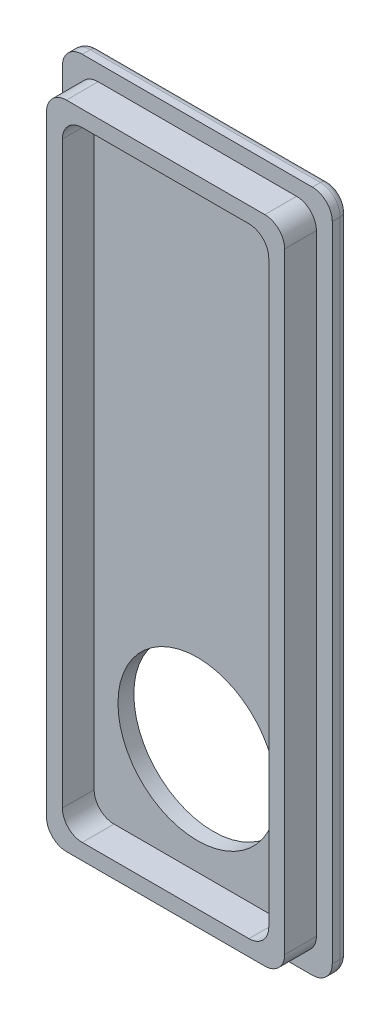
ISO-10303-21;
HEADER;
FILE_DESCRIPTION(('STEP AP214'),'2;1');
FILE_NAME('part.step','',(''),(''),'','','');
FILE_SCHEMA(('AUTOMOTIVE_DESIGN { 1 0 10303 214 1 1 1 1 }'));
ENDSEC;
DATA;
#1=APPLICATION_CONTEXT('core data for automotive mechanical design processes');
#2=APPLICATION_PROTOCOL_DEFINITION('international standard','automotive_design',2000,#1);
#3=PRODUCT_CONTEXT('',#1,'mechanical');
#4=PRODUCT('Part','Part','',(#3));
#5=PRODUCT_RELATED_PRODUCT_CATEGORY('part','',(#4));
#6=PRODUCT_DEFINITION_FORMATION('','',#4);
#7=PRODUCT_DEFINITION_CONTEXT('part definition',#1,'design');
#8=PRODUCT_DEFINITION('design','',#6,#7);
#9=PRODUCT_DEFINITION_SHAPE('','',#8);
#10=(LENGTH_UNIT() NAMED_UNIT(*) SI_UNIT(.MILLI.,.METRE.));
#11=(NAMED_UNIT(*) PLANE_ANGLE_UNIT() SI_UNIT($,.RADIAN.));
#12=(NAMED_UNIT(*) SI_UNIT($,.STERADIAN.) SOLID_ANGLE_UNIT());
#13=UNCERTAINTY_MEASURE_WITH_UNIT(LENGTH_MEASURE(1.E-05),#10,'distance_accuracy_value','');
#14=(GEOMETRIC_REPRESENTATION_CONTEXT(3) GLOBAL_UNCERTAINTY_ASSIGNED_CONTEXT((#13)) GLOBAL_UNIT_ASSIGNED_CONTEXT((#10,
#11,#12)) REPRESENTATION_CONTEXT('',''));
#15=CARTESIAN_POINT('',(0.,0.,0.));
#16=DIRECTION('',(0.,0.,1.));
#17=DIRECTION('',(1.,0.,0.));
#18=AXIS2_PLACEMENT_3D('',#15,#16,#17);
#19=CARTESIAN_POINT('',(0.,0.,0.));
#20=DIRECTION('',(0.,0.,1.));
#21=DIRECTION('',(1.,0.,0.));
#22=AXIS2_PLACEMENT_3D('',#19,#20,#21);
#23=PLANE('',#22);
#24=CARTESIAN_POINT('',(0.,-25.5534223434568,0.));
#25=DIRECTION('',(0.,0.,-1.));
#26=DIRECTION('',(-1.,0.,0.));
#27=AXIS2_PLACEMENT_3D('',#24,#25,#26);
#28=CIRCLE('',#27,10.);
#29=CARTESIAN_POINT('',(-10.,-25.5534223434568,0.));
#30=VERTEX_POINT('',#29);
#31=EDGE_CURVE('E383',#30,#30,#28,.T.);
#32=ORIENTED_EDGE('',*,*,#31,.F.);
#33=EDGE_LOOP('',(#32));
#34=FACE_BOUND('',#33,.T.);
#35=CARTESIAN_POINT('',(-14.5,-40.5,0.));
#36=DIRECTION('',(0.,0.,1.));
#37=DIRECTION('',(1.,0.,0.));
#38=AXIS2_PLACEMENT_3D('',#35,#36,#37);
#39=CIRCLE('',#38,1.5);
#40=CARTESIAN_POINT('',(-16.,-40.5,0.));
#41=VERTEX_POINT('',#40);
#42=CARTESIAN_POINT('',(-14.5,-42.,0.));
#43=VERTEX_POINT('',#42);
#44=EDGE_CURVE('E259',#41,#43,#39,.T.);
#45=ORIENTED_EDGE('',*,*,#44,.F.);
#46=DIRECTION('',(0.,-1.,0.));
#47=VECTOR('',#46,1.);
#48=CARTESIAN_POINT('',(-16.,0.,0.));
#49=LINE('',#48,#47);
#50=CARTESIAN_POINT('',(-16.,40.5,0.));
#51=VERTEX_POINT('',#50);
#52=EDGE_CURVE('E456',#41,#51,#49,.F.);
#53=ORIENTED_EDGE('',*,*,#52,.T.);
#54=CARTESIAN_POINT('',(-14.5,40.5,0.));
#55=DIRECTION('',(0.,0.,1.));
#56=DIRECTION('',(1.,0.,0.));
#57=AXIS2_PLACEMENT_3D('',#54,#55,#56);
#58=CIRCLE('',#57,1.5);
#59=CARTESIAN_POINT('',(-14.5,42.,0.));
#60=VERTEX_POINT('',#59);
#61=EDGE_CURVE('E260',#60,#51,#58,.T.);
#62=ORIENTED_EDGE('',*,*,#61,.F.);
#63=DIRECTION('',(-1.,0.,0.));
#64=VECTOR('',#63,1.);
#65=CARTESIAN_POINT('',(0.,42.,0.));
#66=LINE('',#65,#64);
#67=CARTESIAN_POINT('',(14.5,42.,0.));
#68=VERTEX_POINT('',#67);
#69=EDGE_CURVE('E453',#60,#68,#66,.F.);
#70=ORIENTED_EDGE('',*,*,#69,.T.);
#71=CARTESIAN_POINT('',(14.5,40.5,0.));
#72=DIRECTION('',(0.,0.,1.));
#73=DIRECTION('',(1.,0.,0.));
#74=AXIS2_PLACEMENT_3D('',#71,#72,#73);
#75=CIRCLE('',#74,1.5);
#76=CARTESIAN_POINT('',(16.,40.5,0.));
#77=VERTEX_POINT('',#76);
#78=EDGE_CURVE('E263',#77,#68,#75,.T.);
#79=ORIENTED_EDGE('',*,*,#78,.F.);
#80=DIRECTION('',(0.,1.,0.));
#81=VECTOR('',#80,1.);
#82=CARTESIAN_POINT('',(16.,0.,0.));
#83=LINE('',#82,#81);
#84=CARTESIAN_POINT('',(16.,-40.5,0.));
#85=VERTEX_POINT('',#84);
#86=EDGE_CURVE('E448',#77,#85,#83,.F.);
#87=ORIENTED_EDGE('',*,*,#86,.T.);
#88=CARTESIAN_POINT('',(14.5,-40.5,0.));
#89=DIRECTION('',(0.,0.,1.));
#90=DIRECTION('',(1.,0.,0.));
#91=AXIS2_PLACEMENT_3D('',#88,#89,#90);
#92=CIRCLE('',#91,1.5);
#93=CARTESIAN_POINT('',(14.5,-42.,0.));
#94=VERTEX_POINT('',#93);
#95=EDGE_CURVE('E270',#94,#85,#92,.T.);
#96=ORIENTED_EDGE('',*,*,#95,.F.);
#97=DIRECTION('',(1.,0.,0.));
#98=VECTOR('',#97,1.);
#99=CARTESIAN_POINT('',(0.,-42.,0.));
#100=LINE('',#99,#98);
#101=EDGE_CURVE('E451',#94,#43,#100,.F.);
#102=ORIENTED_EDGE('',*,*,#101,.T.);
#103=EDGE_LOOP('',(#45,#53,#62,#70,#79,#87,#96,#102));
#104=FACE_BOUND('',#103,.T.);
#105=ADVANCED_FACE('F35',(#34,#104),#23,.F.);
#106=CARTESIAN_POINT('',(0.,0.,2.));
#107=DIRECTION('',(0.,0.,1.));
#108=DIRECTION('',(1.,0.,0.));
#109=AXIS2_PLACEMENT_3D('',#106,#107,#108);
#110=PLANE('',#109);
#111=DIRECTION('',(-1.,0.,0.));
#112=VECTOR('',#111,1.);
#113=CARTESIAN_POINT('',(17.,43.,2.));
#114=LINE('',#113,#112);
#115=CARTESIAN_POINT('',(14.5,43.,2.));
#116=VERTEX_POINT('',#115);
#117=CARTESIAN_POINT('',(-14.5,43.,2.));
#118=VERTEX_POINT('',#117);
#119=EDGE_CURVE('E442',#116,#118,#114,.T.);
#120=ORIENTED_EDGE('',*,*,#119,.T.);
#121=CARTESIAN_POINT('',(-14.5,40.5,2.));
#122=DIRECTION('',(0.,0.,1.));
#123=DIRECTION('',(1.,0.,0.));
#124=AXIS2_PLACEMENT_3D('',#121,#122,#123);
#125=CIRCLE('',#124,2.5);
#126=CARTESIAN_POINT('',(-17.,40.5,2.));
#127=VERTEX_POINT('',#126);
#128=EDGE_CURVE('E327',#118,#127,#125,.T.);
#129=ORIENTED_EDGE('',*,*,#128,.T.);
#130=DIRECTION('',(0.,-1.,0.));
#131=VECTOR('',#130,1.);
#132=CARTESIAN_POINT('',(-17.,-43.,2.));
#133=LINE('',#132,#131);
#134=CARTESIAN_POINT('',(-17.,-40.5,2.));
#135=VERTEX_POINT('',#134);
#136=EDGE_CURVE('E426',#127,#135,#133,.T.);
#137=ORIENTED_EDGE('',*,*,#136,.T.);
#138=CARTESIAN_POINT('',(-14.5,-40.5,2.));
#139=DIRECTION('',(0.,0.,1.));
#140=DIRECTION('',(1.,0.,0.));
#141=AXIS2_PLACEMENT_3D('',#138,#139,#140);
#142=CIRCLE('',#141,2.5);
#143=CARTESIAN_POINT('',(-14.5,-43.,2.));
#144=VERTEX_POINT('',#143);
#145=EDGE_CURVE('E321',#135,#144,#142,.T.);
#146=ORIENTED_EDGE('',*,*,#145,.T.);
#147=DIRECTION('',(1.,0.,0.));
#148=VECTOR('',#147,1.);
#149=CARTESIAN_POINT('',(17.,-43.,2.));
#150=LINE('',#149,#148);
#151=CARTESIAN_POINT('',(14.5,-43.,2.));
#152=VERTEX_POINT('',#151);
#153=EDGE_CURVE('E230',#144,#152,#150,.T.);
#154=ORIENTED_EDGE('',*,*,#153,.T.);
#155=CARTESIAN_POINT('',(14.5,-40.5,2.));
#156=DIRECTION('',(0.,0.,1.));
#157=DIRECTION('',(1.,0.,0.));
#158=AXIS2_PLACEMENT_3D('',#155,#156,#157);
#159=CIRCLE('',#158,2.5);
#160=CARTESIAN_POINT('',(17.,-40.5,2.));
#161=VERTEX_POINT('',#160);
#162=EDGE_CURVE('E323',#152,#161,#159,.T.);
#163=ORIENTED_EDGE('',*,*,#162,.T.);
#164=DIRECTION('',(0.,1.,0.));
#165=VECTOR('',#164,1.);
#166=CARTESIAN_POINT('',(17.,-43.,2.));
#167=LINE('',#166,#165);
#168=CARTESIAN_POINT('',(17.,40.5,2.));
#169=VERTEX_POINT('',#168);
#170=EDGE_CURVE('E439',#161,#169,#167,.T.);
#171=ORIENTED_EDGE('',*,*,#170,.T.);
#172=CARTESIAN_POINT('',(14.5,40.5,2.));
#173=DIRECTION('',(0.,0.,1.));
#174=DIRECTION('',(1.,0.,0.));
#175=AXIS2_PLACEMENT_3D('',#172,#173,#174);
#176=CIRCLE('',#175,2.5);
#177=EDGE_CURVE('E325',#169,#116,#176,.T.);
#178=ORIENTED_EDGE('',*,*,#177,.T.);
#179=EDGE_LOOP('',(#120,#129,#137,#146,#154,#163,#171,#178));
#180=FACE_BOUND('',#179,.T.);
#181=DIRECTION('',(1.,0.,0.));
#182=VECTOR('',#181,1.);
#183=CARTESIAN_POINT('',(15.,-41.,2.));
#184=LINE('',#183,#182);
#185=CARTESIAN_POINT('',(-12.5,-41.,2.));
#186=VERTEX_POINT('',#185);
#187=CARTESIAN_POINT('',(12.5,-41.,2.));
#188=VERTEX_POINT('',#187);
#189=EDGE_CURVE('E429',#186,#188,#184,.T.);
#190=ORIENTED_EDGE('',*,*,#189,.F.);
#191=CARTESIAN_POINT('',(-12.5,-38.5,2.));
#192=DIRECTION('',(0.,0.,1.));
#193=DIRECTION('',(1.,0.,0.));
#194=AXIS2_PLACEMENT_3D('',#191,#192,#193);
#195=CIRCLE('',#194,2.5);
#196=CARTESIAN_POINT('',(-15.,-38.5,2.));
#197=VERTEX_POINT('',#196);
#198=EDGE_CURVE('E11',#186,#197,#195,.F.);
#199=ORIENTED_EDGE('',*,*,#198,.T.);
#200=DIRECTION('',(0.,-1.,0.));
#201=VECTOR('',#200,1.);
#202=CARTESIAN_POINT('',(-15.,-41.,2.));
#203=LINE('',#202,#201);
#204=CARTESIAN_POINT('',(-15.,38.5,2.));
#205=VERTEX_POINT('',#204);
#206=EDGE_CURVE('E404',#205,#197,#203,.T.);
#207=ORIENTED_EDGE('',*,*,#206,.F.);
#208=CARTESIAN_POINT('',(-12.5,38.5,2.));
#209=DIRECTION('',(0.,0.,1.));
#210=DIRECTION('',(1.,0.,0.));
#211=AXIS2_PLACEMENT_3D('',#208,#209,#210);
#212=CIRCLE('',#211,2.5);
#213=CARTESIAN_POINT('',(-12.5,41.,2.));
#214=VERTEX_POINT('',#213);
#215=EDGE_CURVE('E368',#205,#214,#212,.F.);
#216=ORIENTED_EDGE('',*,*,#215,.T.);
#217=DIRECTION('',(-1.,0.,0.));
#218=VECTOR('',#217,1.);
#219=CARTESIAN_POINT('',(15.,41.,2.));
#220=LINE('',#219,#218);
#221=CARTESIAN_POINT('',(12.5,41.,2.));
#222=VERTEX_POINT('',#221);
#223=EDGE_CURVE('E419',#222,#214,#220,.T.);
#224=ORIENTED_EDGE('',*,*,#223,.F.);
#225=CARTESIAN_POINT('',(12.5,38.5,2.));
#226=DIRECTION('',(0.,0.,1.));
#227=DIRECTION('',(1.,0.,0.));
#228=AXIS2_PLACEMENT_3D('',#225,#226,#227);
#229=CIRCLE('',#228,2.5);
#230=CARTESIAN_POINT('',(15.,38.5,2.));
#231=VERTEX_POINT('',#230);
#232=EDGE_CURVE('E370',#222,#231,#229,.F.);
#233=ORIENTED_EDGE('',*,*,#232,.T.);
#234=DIRECTION('',(0.,1.,0.));
#235=VECTOR('',#234,1.);
#236=CARTESIAN_POINT('',(15.,-41.,2.));
#237=LINE('',#236,#235);
#238=CARTESIAN_POINT('',(15.,-38.5,2.));
#239=VERTEX_POINT('',#238);
#240=EDGE_CURVE('E432',#239,#231,#237,.T.);
#241=ORIENTED_EDGE('',*,*,#240,.F.);
#242=CARTESIAN_POINT('',(12.5,-38.5,2.));
#243=DIRECTION('',(0.,0.,1.));
#244=DIRECTION('',(1.,0.,0.));
#245=AXIS2_PLACEMENT_3D('',#242,#243,#244);
#246=CIRCLE('',#245,2.5);
#247=EDGE_CURVE('E44',#239,#188,#246,.F.);
#248=ORIENTED_EDGE('',*,*,#247,.T.);
#249=EDGE_LOOP('',(#190,#199,#207,#216,#224,#233,#241,#248));
#250=FACE_BOUND('',#249,.T.);
#251=ADVANCED_FACE('F497',(#180,#250),#110,.T.);
#252=CARTESIAN_POINT('',(-17.,-43.,2.));
#253=DIRECTION('',(1.,0.,0.));
#254=DIRECTION('',(0.,0.,-1.));
#255=AXIS2_PLACEMENT_3D('',#252,#253,#254);
#256=PLANE('',#255);
#257=ORIENTED_EDGE('',*,*,#136,.F.);
#258=DIRECTION('',(0.,0.,-1.));
#259=VECTOR('',#258,1.);
#260=CARTESIAN_POINT('',(-17.,40.5,2.));
#261=LINE('',#260,#259);
#262=CARTESIAN_POINT('',(-17.,40.5,1.));
#263=VERTEX_POINT('',#262);
#264=EDGE_CURVE('E315',#127,#263,#261,.T.);
#265=ORIENTED_EDGE('',*,*,#264,.T.);
#266=DIRECTION('',(0.,-1.,0.));
#267=VECTOR('',#266,1.);
#268=CARTESIAN_POINT('',(-17.,-43.,1.));
#269=LINE('',#268,#267);
#270=CARTESIAN_POINT('',(-17.,-40.5,1.));
#271=VERTEX_POINT('',#270);
#272=EDGE_CURVE('E445',#263,#271,#269,.T.);
#273=ORIENTED_EDGE('',*,*,#272,.T.);
#274=DIRECTION('',(0.,0.,-1.));
#275=VECTOR('',#274,1.);
#276=CARTESIAN_POINT('',(-17.,-40.5,2.));
#277=LINE('',#276,#275);
#278=EDGE_CURVE('E252',#271,#135,#277,.F.);
#279=ORIENTED_EDGE('',*,*,#278,.T.);
#280=EDGE_LOOP('',(#257,#265,#273,#279));
#281=FACE_BOUND('',#280,.T.);
#282=ADVANCED_FACE('F500',(#281),#256,.F.);
#283=CARTESIAN_POINT('',(17.,-43.,2.));
#284=DIRECTION('',(0.,1.,0.));
#285=DIRECTION('',(-1.,0.,0.));
#286=AXIS2_PLACEMENT_3D('',#283,#284,#285);
#287=PLANE('',#286);
#288=DIRECTION('',(1.,0.,0.));
#289=VECTOR('',#288,1.);
#290=CARTESIAN_POINT('',(17.,-43.,1.));
#291=LINE('',#290,#289);
#292=CARTESIAN_POINT('',(-14.5,-43.,1.));
#293=VERTEX_POINT('',#292);
#294=CARTESIAN_POINT('',(14.5,-43.,1.));
#295=VERTEX_POINT('',#294);
#296=EDGE_CURVE('E227',#293,#295,#291,.T.);
#297=ORIENTED_EDGE('',*,*,#296,.T.);
#298=DIRECTION('',(0.,0.,-1.));
#299=VECTOR('',#298,1.);
#300=CARTESIAN_POINT('',(14.5,-43.,2.));
#301=LINE('',#300,#299);
#302=EDGE_CURVE('E234',#295,#152,#301,.F.);
#303=ORIENTED_EDGE('',*,*,#302,.T.);
#304=ORIENTED_EDGE('',*,*,#153,.F.);
#305=DIRECTION('',(0.,0.,-1.));
#306=VECTOR('',#305,1.);
#307=CARTESIAN_POINT('',(-14.5,-43.,2.));
#308=LINE('',#307,#306);
#309=EDGE_CURVE('E224',#144,#293,#308,.T.);
#310=ORIENTED_EDGE('',*,*,#309,.T.);
#311=EDGE_LOOP('',(#297,#303,#304,#310));
#312=FACE_BOUND('',#311,.T.);
#313=ADVANCED_FACE('F226',(#312),#287,.F.);
#314=CARTESIAN_POINT('',(17.,-43.,2.));
#315=DIRECTION('',(-1.,0.,0.));
#316=DIRECTION('',(0.,0.,1.));
#317=AXIS2_PLACEMENT_3D('',#314,#315,#316);
#318=PLANE('',#317);
#319=DIRECTION('',(0.,1.,0.));
#320=VECTOR('',#319,1.);
#321=CARTESIAN_POINT('',(17.,-43.,1.));
#322=LINE('',#321,#320);
#323=CARTESIAN_POINT('',(17.,-40.5,1.));
#324=VERTEX_POINT('',#323);
#325=CARTESIAN_POINT('',(17.,40.5,1.));
#326=VERTEX_POINT('',#325);
#327=EDGE_CURVE('E245',#324,#326,#322,.T.);
#328=ORIENTED_EDGE('',*,*,#327,.T.);
#329=DIRECTION('',(0.,0.,-1.));
#330=VECTOR('',#329,1.);
#331=CARTESIAN_POINT('',(17.,40.5,2.));
#332=LINE('',#331,#330);
#333=EDGE_CURVE('E348',#326,#169,#332,.F.);
#334=ORIENTED_EDGE('',*,*,#333,.T.);
#335=ORIENTED_EDGE('',*,*,#170,.F.);
#336=DIRECTION('',(0.,0.,-1.));
#337=VECTOR('',#336,1.);
#338=CARTESIAN_POINT('',(17.,-40.5,2.));
#339=LINE('',#338,#337);
#340=EDGE_CURVE('E346',#161,#324,#339,.T.);
#341=ORIENTED_EDGE('',*,*,#340,.T.);
#342=EDGE_LOOP('',(#328,#334,#335,#341));
#343=FACE_BOUND('',#342,.T.);
#344=ADVANCED_FACE('F464',(#343),#318,.F.);
#345=CARTESIAN_POINT('',(17.,43.,2.));
#346=DIRECTION('',(0.,-1.,0.));
#347=DIRECTION('',(1.,0.,0.));
#348=AXIS2_PLACEMENT_3D('',#345,#346,#347);
#349=PLANE('',#348);
#350=DIRECTION('',(-1.,0.,0.));
#351=VECTOR('',#350,1.);
#352=CARTESIAN_POINT('',(17.,43.,1.));
#353=LINE('',#352,#351);
#354=CARTESIAN_POINT('',(14.5,43.,1.));
#355=VERTEX_POINT('',#354);
#356=CARTESIAN_POINT('',(-14.5,43.,1.));
#357=VERTEX_POINT('',#356);
#358=EDGE_CURVE('E246',#355,#357,#353,.T.);
#359=ORIENTED_EDGE('',*,*,#358,.T.);
#360=DIRECTION('',(0.,0.,-1.));
#361=VECTOR('',#360,1.);
#362=CARTESIAN_POINT('',(-14.5,43.,2.));
#363=LINE('',#362,#361);
#364=EDGE_CURVE('E319',#357,#118,#363,.F.);
#365=ORIENTED_EDGE('',*,*,#364,.T.);
#366=ORIENTED_EDGE('',*,*,#119,.F.);
#367=DIRECTION('',(0.,0.,-1.));
#368=VECTOR('',#367,1.);
#369=CARTESIAN_POINT('',(14.5,43.,2.));
#370=LINE('',#369,#368);
#371=EDGE_CURVE('E317',#116,#355,#370,.T.);
#372=ORIENTED_EDGE('',*,*,#371,.T.);
#373=EDGE_LOOP('',(#359,#365,#366,#372));
#374=FACE_BOUND('',#373,.T.);
#375=ADVANCED_FACE('F489',(#374),#349,.F.);
#376=CARTESIAN_POINT('',(0.,0.,6.));
#377=DIRECTION('',(0.,0.,1.));
#378=DIRECTION('',(1.,0.,0.));
#379=AXIS2_PLACEMENT_3D('',#376,#377,#378);
#380=PLANE('',#379);
#381=DIRECTION('',(-1.,0.,0.));
#382=VECTOR('',#381,1.);
#383=CARTESIAN_POINT('',(15.,41.,6.));
#384=LINE('',#383,#382);
#385=CARTESIAN_POINT('',(12.5,41.,6.));
#386=VERTEX_POINT('',#385);
#387=CARTESIAN_POINT('',(-12.5,41.,6.));
#388=VERTEX_POINT('',#387);
#389=EDGE_CURVE('E423',#386,#388,#384,.T.);
#390=ORIENTED_EDGE('',*,*,#389,.T.);
#391=CARTESIAN_POINT('',(-12.5,38.5,6.));
#392=DIRECTION('',(0.,0.,1.));
#393=DIRECTION('',(1.,0.,0.));
#394=AXIS2_PLACEMENT_3D('',#391,#392,#393);
#395=CIRCLE('',#394,2.5);
#396=CARTESIAN_POINT('',(-15.,38.5,6.));
#397=VERTEX_POINT('',#396);
#398=EDGE_CURVE('E344',#388,#397,#395,.T.);
#399=ORIENTED_EDGE('',*,*,#398,.T.);
#400=DIRECTION('',(0.,-1.,0.));
#401=VECTOR('',#400,1.);
#402=CARTESIAN_POINT('',(-15.,-41.,6.));
#403=LINE('',#402,#401);
#404=CARTESIAN_POINT('',(-15.,-38.5,6.));
#405=VERTEX_POINT('',#404);
#406=EDGE_CURVE('E415',#397,#405,#403,.T.);
#407=ORIENTED_EDGE('',*,*,#406,.T.);
#408=CARTESIAN_POINT('',(-12.5,-38.5,6.));
#409=DIRECTION('',(0.,0.,1.));
#410=DIRECTION('',(1.,0.,0.));
#411=AXIS2_PLACEMENT_3D('',#408,#409,#410);
#412=CIRCLE('',#411,2.5);
#413=CARTESIAN_POINT('',(-12.5,-41.,6.));
#414=VERTEX_POINT('',#413);
#415=EDGE_CURVE('E339',#405,#414,#412,.T.);
#416=ORIENTED_EDGE('',*,*,#415,.T.);
#417=DIRECTION('',(1.,0.,0.));
#418=VECTOR('',#417,1.);
#419=CARTESIAN_POINT('',(15.,-41.,6.));
#420=LINE('',#419,#418);
#421=CARTESIAN_POINT('',(12.5,-41.,6.));
#422=VERTEX_POINT('',#421);
#423=EDGE_CURVE('E418',#414,#422,#420,.T.);
#424=ORIENTED_EDGE('',*,*,#423,.T.);
#425=CARTESIAN_POINT('',(12.5,-38.5,6.));
#426=DIRECTION('',(0.,0.,1.));
#427=DIRECTION('',(1.,0.,0.));
#428=AXIS2_PLACEMENT_3D('',#425,#426,#427);
#429=CIRCLE('',#428,2.5);
#430=CARTESIAN_POINT('',(15.,-38.5,6.));
#431=VERTEX_POINT('',#430);
#432=EDGE_CURVE('E59',#422,#431,#429,.T.);
#433=ORIENTED_EDGE('',*,*,#432,.T.);
#434=DIRECTION('',(0.,1.,0.));
#435=VECTOR('',#434,1.);
#436=CARTESIAN_POINT('',(15.,-41.,6.));
#437=LINE('',#436,#435);
#438=CARTESIAN_POINT('',(15.,38.5,6.));
#439=VERTEX_POINT('',#438);
#440=EDGE_CURVE('E421',#431,#439,#437,.T.);
#441=ORIENTED_EDGE('',*,*,#440,.T.);
#442=CARTESIAN_POINT('',(12.5,38.5,6.));
#443=DIRECTION('',(0.,0.,1.));
#444=DIRECTION('',(1.,0.,0.));
#445=AXIS2_PLACEMENT_3D('',#442,#443,#444);
#446=CIRCLE('',#445,2.5);
#447=EDGE_CURVE('E342',#439,#386,#446,.T.);
#448=ORIENTED_EDGE('',*,*,#447,.T.);
#449=EDGE_LOOP('',(#390,#399,#407,#416,#424,#433,#441,#448));
#450=FACE_BOUND('',#449,.T.);
#451=DIRECTION('',(1.,0.,0.));
#452=VECTOR('',#451,1.);
#453=CARTESIAN_POINT('',(13.,-39.,6.));
#454=LINE('',#453,#452);
#455=CARTESIAN_POINT('',(-10.5,-39.,6.));
#456=VERTEX_POINT('',#455);
#457=CARTESIAN_POINT('',(10.5,-39.,6.));
#458=VERTEX_POINT('',#457);
#459=EDGE_CURVE('E394',#456,#458,#454,.T.);
#460=ORIENTED_EDGE('',*,*,#459,.F.);
#461=CARTESIAN_POINT('',(-10.5,-36.5,6.));
#462=DIRECTION('',(0.,0.,1.));
#463=DIRECTION('',(1.,0.,0.));
#464=AXIS2_PLACEMENT_3D('',#461,#462,#463);
#465=CIRCLE('',#464,2.5);
#466=CARTESIAN_POINT('',(-13.,-36.5,6.));
#467=VERTEX_POINT('',#466);
#468=EDGE_CURVE('E362',#456,#467,#465,.F.);
#469=ORIENTED_EDGE('',*,*,#468,.T.);
#470=DIRECTION('',(0.,-1.,0.));
#471=VECTOR('',#470,1.);
#472=CARTESIAN_POINT('',(-13.,-39.,6.));
#473=LINE('',#472,#471);
#474=CARTESIAN_POINT('',(-13.,36.5,6.));
#475=VERTEX_POINT('',#474);
#476=EDGE_CURVE('E391',#475,#467,#473,.T.);
#477=ORIENTED_EDGE('',*,*,#476,.F.);
#478=CARTESIAN_POINT('',(-10.5,36.5,6.));
#479=DIRECTION('',(0.,0.,1.));
#480=DIRECTION('',(1.,0.,0.));
#481=AXIS2_PLACEMENT_3D('',#478,#479,#480);
#482=CIRCLE('',#481,2.5);
#483=CARTESIAN_POINT('',(-10.5,39.,6.));
#484=VERTEX_POINT('',#483);
#485=EDGE_CURVE('E366',#475,#484,#482,.F.);
#486=ORIENTED_EDGE('',*,*,#485,.T.);
#487=DIRECTION('',(-1.,0.,0.));
#488=VECTOR('',#487,1.);
#489=CARTESIAN_POINT('',(13.,39.,6.));
#490=LINE('',#489,#488);
#491=CARTESIAN_POINT('',(10.5,39.,6.));
#492=VERTEX_POINT('',#491);
#493=EDGE_CURVE('E401',#492,#484,#490,.T.);
#494=ORIENTED_EDGE('',*,*,#493,.F.);
#495=CARTESIAN_POINT('',(10.5,36.5,6.));
#496=DIRECTION('',(0.,0.,1.));
#497=DIRECTION('',(1.,0.,0.));
#498=AXIS2_PLACEMENT_3D('',#495,#496,#497);
#499=CIRCLE('',#498,2.5);
#500=CARTESIAN_POINT('',(13.,36.5,6.));
#501=VERTEX_POINT('',#500);
#502=EDGE_CURVE('E364',#492,#501,#499,.F.);
#503=ORIENTED_EDGE('',*,*,#502,.T.);
#504=DIRECTION('',(0.,1.,0.));
#505=VECTOR('',#504,1.);
#506=CARTESIAN_POINT('',(13.,-39.,6.));
#507=LINE('',#506,#505);
#508=CARTESIAN_POINT('',(13.,-36.5,6.));
#509=VERTEX_POINT('',#508);
#510=EDGE_CURVE('E398',#509,#501,#507,.T.);
#511=ORIENTED_EDGE('',*,*,#510,.F.);
#512=CARTESIAN_POINT('',(10.5,-36.5,6.));
#513=DIRECTION('',(0.,0.,1.));
#514=DIRECTION('',(1.,0.,0.));
#515=AXIS2_PLACEMENT_3D('',#512,#513,#514);
#516=CIRCLE('',#515,2.5);
#517=EDGE_CURVE('E360',#509,#458,#516,.F.);
#518=ORIENTED_EDGE('',*,*,#517,.T.);
#519=EDGE_LOOP('',(#460,#469,#477,#486,#494,#503,#511,#518));
#520=FACE_BOUND('',#519,.T.);
#521=ADVANCED_FACE('F525',(#450,#520),#380,.T.);
#522=CARTESIAN_POINT('',(-15.,-41.,6.));
#523=DIRECTION('',(1.,0.,0.));
#524=DIRECTION('',(0.,0.,-1.));
#525=AXIS2_PLACEMENT_3D('',#522,#523,#524);
#526=PLANE('',#525);
#527=ORIENTED_EDGE('',*,*,#406,.F.);
#528=DIRECTION('',(0.,0.,-1.));
#529=VECTOR('',#528,1.);
#530=CARTESIAN_POINT('',(-15.,38.5,6.));
#531=LINE('',#530,#529);
#532=EDGE_CURVE('E331',#397,#205,#531,.T.);
#533=ORIENTED_EDGE('',*,*,#532,.T.);
#534=ORIENTED_EDGE('',*,*,#206,.T.);
#535=DIRECTION('',(0.,0.,-1.));
#536=VECTOR('',#535,1.);
#537=CARTESIAN_POINT('',(-15.,-38.5,6.));
#538=LINE('',#537,#536);
#539=EDGE_CURVE('E329',#197,#405,#538,.F.);
#540=ORIENTED_EDGE('',*,*,#539,.T.);
#541=EDGE_LOOP('',(#527,#533,#534,#540));
#542=FACE_BOUND('',#541,.T.);
#543=ADVANCED_FACE('F552',(#542),#526,.F.);
#544=CARTESIAN_POINT('',(15.,-41.,6.));
#545=DIRECTION('',(0.,1.,0.));
#546=DIRECTION('',(0.,0.,1.));
#547=AXIS2_PLACEMENT_3D('',#544,#545,#546);
#548=PLANE('',#547);
#549=ORIENTED_EDGE('',*,*,#189,.T.);
#550=DIRECTION('',(0.,0.,-1.));
#551=VECTOR('',#550,1.);
#552=CARTESIAN_POINT('',(12.5,-41.,6.));
#553=LINE('',#552,#551);
#554=EDGE_CURVE('E358',#188,#422,#553,.F.);
#555=ORIENTED_EDGE('',*,*,#554,.T.);
#556=ORIENTED_EDGE('',*,*,#423,.F.);
#557=DIRECTION('',(0.,0.,-1.));
#558=VECTOR('',#557,1.);
#559=CARTESIAN_POINT('',(-12.5,-41.,6.));
#560=LINE('',#559,#558);
#561=EDGE_CURVE('E355',#414,#186,#560,.T.);
#562=ORIENTED_EDGE('',*,*,#561,.T.);
#563=EDGE_LOOP('',(#549,#555,#556,#562));
#564=FACE_BOUND('',#563,.T.);
#565=ADVANCED_FACE('F559',(#564),#548,.F.);
#566=CARTESIAN_POINT('',(15.,-41.,6.));
#567=DIRECTION('',(-1.,0.,0.));
#568=DIRECTION('',(0.,0.,1.));
#569=AXIS2_PLACEMENT_3D('',#566,#567,#568);
#570=PLANE('',#569);
#571=ORIENTED_EDGE('',*,*,#240,.T.);
#572=DIRECTION('',(0.,0.,-1.));
#573=VECTOR('',#572,1.);
#574=CARTESIAN_POINT('',(15.,38.5,6.));
#575=LINE('',#574,#573);
#576=EDGE_CURVE('E52',#231,#439,#575,.F.);
#577=ORIENTED_EDGE('',*,*,#576,.T.);
#578=ORIENTED_EDGE('',*,*,#440,.F.);
#579=DIRECTION('',(0.,0.,-1.));
#580=VECTOR('',#579,1.);
#581=CARTESIAN_POINT('',(15.,-38.5,6.));
#582=LINE('',#581,#580);
#583=EDGE_CURVE('E350',#431,#239,#582,.T.);
#584=ORIENTED_EDGE('',*,*,#583,.T.);
#585=EDGE_LOOP('',(#571,#577,#578,#584));
#586=FACE_BOUND('',#585,.T.);
#587=ADVANCED_FACE('F566',(#586),#570,.F.);
#588=CARTESIAN_POINT('',(15.,41.,6.));
#589=DIRECTION('',(0.,-1.,0.));
#590=DIRECTION('',(1.,0.,0.));
#591=AXIS2_PLACEMENT_3D('',#588,#589,#590);
#592=PLANE('',#591);
#593=ORIENTED_EDGE('',*,*,#223,.T.);
#594=DIRECTION('',(0.,0.,-1.));
#595=VECTOR('',#594,1.);
#596=CARTESIAN_POINT('',(-12.5,41.,6.));
#597=LINE('',#596,#595);
#598=EDGE_CURVE('E337',#214,#388,#597,.F.);
#599=ORIENTED_EDGE('',*,*,#598,.T.);
#600=ORIENTED_EDGE('',*,*,#389,.F.);
#601=DIRECTION('',(0.,0.,-1.));
#602=VECTOR('',#601,1.);
#603=CARTESIAN_POINT('',(12.5,41.,6.));
#604=LINE('',#603,#602);
#605=EDGE_CURVE('E334',#386,#222,#604,.T.);
#606=ORIENTED_EDGE('',*,*,#605,.T.);
#607=EDGE_LOOP('',(#593,#599,#600,#606));
#608=FACE_BOUND('',#607,.T.);
#609=ADVANCED_FACE('F574',(#608),#592,.F.);
#610=CARTESIAN_POINT('',(-13.,-39.,6.));
#611=DIRECTION('',(1.,0.,0.));
#612=DIRECTION('',(0.,0.,-1.));
#613=AXIS2_PLACEMENT_3D('',#610,#611,#612);
#614=PLANE('',#613);
#615=ORIENTED_EDGE('',*,*,#476,.T.);
#616=DIRECTION('',(0.,0.,-1.));
#617=VECTOR('',#616,1.);
#618=CARTESIAN_POINT('',(-13.,-36.5,2.));
#619=LINE('',#618,#617);
#620=CARTESIAN_POINT('',(-13.,-36.5,2.));
#621=VERTEX_POINT('',#620);
#622=EDGE_CURVE('E306',#467,#621,#619,.T.);
#623=ORIENTED_EDGE('',*,*,#622,.T.);
#624=DIRECTION('',(0.,-1.,0.));
#625=VECTOR('',#624,1.);
#626=CARTESIAN_POINT('',(-13.,-39.,2.));
#627=LINE('',#626,#625);
#628=CARTESIAN_POINT('',(-13.,36.5,2.));
#629=VERTEX_POINT('',#628);
#630=EDGE_CURVE('E255',#629,#621,#627,.T.);
#631=ORIENTED_EDGE('',*,*,#630,.F.);
#632=DIRECTION('',(0.,0.,-1.));
#633=VECTOR('',#632,1.);
#634=CARTESIAN_POINT('',(-13.,36.5,6.));
#635=LINE('',#634,#633);
#636=EDGE_CURVE('E304',#629,#475,#635,.F.);
#637=ORIENTED_EDGE('',*,*,#636,.T.);
#638=EDGE_LOOP('',(#615,#623,#631,#637));
#639=FACE_BOUND('',#638,.T.);
#640=ADVANCED_FACE('F581',(#639),#614,.T.);
#641=CARTESIAN_POINT('',(13.,-39.,6.));
#642=DIRECTION('',(0.,1.,0.));
#643=DIRECTION('',(0.,0.,1.));
#644=AXIS2_PLACEMENT_3D('',#641,#642,#643);
#645=PLANE('',#644);
#646=ORIENTED_EDGE('',*,*,#459,.T.);
#647=DIRECTION('',(0.,0.,-1.));
#648=VECTOR('',#647,1.);
#649=CARTESIAN_POINT('',(10.5,-39.,2.));
#650=LINE('',#649,#648);
#651=CARTESIAN_POINT('',(10.5,-39.,2.));
#652=VERTEX_POINT('',#651);
#653=EDGE_CURVE('E288',#458,#652,#650,.T.);
#654=ORIENTED_EDGE('',*,*,#653,.T.);
#655=DIRECTION('',(1.,0.,0.));
#656=VECTOR('',#655,1.);
#657=CARTESIAN_POINT('',(13.,-39.,2.));
#658=LINE('',#657,#656);
#659=CARTESIAN_POINT('',(-10.5,-39.,2.));
#660=VERTEX_POINT('',#659);
#661=EDGE_CURVE('E407',#660,#652,#658,.T.);
#662=ORIENTED_EDGE('',*,*,#661,.F.);
#663=DIRECTION('',(0.,0.,-1.));
#664=VECTOR('',#663,1.);
#665=CARTESIAN_POINT('',(-10.5,-39.,6.));
#666=LINE('',#665,#664);
#667=EDGE_CURVE('E286',#660,#456,#666,.F.);
#668=ORIENTED_EDGE('',*,*,#667,.T.);
#669=EDGE_LOOP('',(#646,#654,#662,#668));
#670=FACE_BOUND('',#669,.T.);
#671=ADVANCED_FACE('F589',(#670),#645,.T.);
#672=CARTESIAN_POINT('',(13.,-39.,6.));
#673=DIRECTION('',(-1.,0.,0.));
#674=DIRECTION('',(0.,0.,1.));
#675=AXIS2_PLACEMENT_3D('',#672,#673,#674);
#676=PLANE('',#675);
#677=DIRECTION('',(0.,1.,0.));
#678=VECTOR('',#677,1.);
#679=CARTESIAN_POINT('',(13.,-39.,2.));
#680=LINE('',#679,#678);
#681=CARTESIAN_POINT('',(13.,-36.5,2.));
#682=VERTEX_POINT('',#681);
#683=CARTESIAN_POINT('',(13.,36.5,2.));
#684=VERTEX_POINT('',#683);
#685=EDGE_CURVE('E410',#682,#684,#680,.T.);
#686=ORIENTED_EDGE('',*,*,#685,.F.);
#687=DIRECTION('',(0.,0.,-1.));
#688=VECTOR('',#687,1.);
#689=CARTESIAN_POINT('',(13.,-36.5,6.));
#690=LINE('',#689,#688);
#691=EDGE_CURVE('E302',#682,#509,#690,.F.);
#692=ORIENTED_EDGE('',*,*,#691,.T.);
#693=ORIENTED_EDGE('',*,*,#510,.T.);
#694=DIRECTION('',(0.,0.,-1.));
#695=VECTOR('',#694,1.);
#696=CARTESIAN_POINT('',(13.,36.5,2.));
#697=LINE('',#696,#695);
#698=EDGE_CURVE('E299',#501,#684,#697,.T.);
#699=ORIENTED_EDGE('',*,*,#698,.T.);
#700=EDGE_LOOP('',(#686,#692,#693,#699));
#701=FACE_BOUND('',#700,.T.);
#702=ADVANCED_FACE('F597',(#701),#676,.T.);
#703=CARTESIAN_POINT('',(13.,39.,6.));
#704=DIRECTION('',(0.,-1.,0.));
#705=DIRECTION('',(0.,0.,-1.));
#706=AXIS2_PLACEMENT_3D('',#703,#704,#705);
#707=PLANE('',#706);
#708=DIRECTION('',(-1.,0.,0.));
#709=VECTOR('',#708,1.);
#710=CARTESIAN_POINT('',(13.,39.,2.));
#711=LINE('',#710,#709);
#712=CARTESIAN_POINT('',(10.5,39.,2.));
#713=VERTEX_POINT('',#712);
#714=CARTESIAN_POINT('',(-10.5,39.,2.));
#715=VERTEX_POINT('',#714);
#716=EDGE_CURVE('E395',#713,#715,#711,.T.);
#717=ORIENTED_EDGE('',*,*,#716,.F.);
#718=DIRECTION('',(0.,0.,-1.));
#719=VECTOR('',#718,1.);
#720=CARTESIAN_POINT('',(10.5,39.,6.));
#721=LINE('',#720,#719);
#722=EDGE_CURVE('E312',#713,#492,#721,.F.);
#723=ORIENTED_EDGE('',*,*,#722,.T.);
#724=ORIENTED_EDGE('',*,*,#493,.T.);
#725=DIRECTION('',(0.,0.,-1.));
#726=VECTOR('',#725,1.);
#727=CARTESIAN_POINT('',(-10.5,39.,2.));
#728=LINE('',#727,#726);
#729=EDGE_CURVE('E309',#484,#715,#728,.T.);
#730=ORIENTED_EDGE('',*,*,#729,.T.);
#731=EDGE_LOOP('',(#717,#723,#724,#730));
#732=FACE_BOUND('',#731,.T.);
#733=ADVANCED_FACE('F605',(#732),#707,.T.);
#734=CARTESIAN_POINT('',(0.,-25.5534223434568,2.));
#735=DIRECTION('',(0.,0.,1.));
#736=DIRECTION('',(1.,0.,0.));
#737=AXIS2_PLACEMENT_3D('',#734,#735,#736);
#738=CIRCLE('',#737,10.);
#739=CARTESIAN_POINT('',(10.,-25.5534223434568,2.));
#740=VERTEX_POINT('',#739);
#741=EDGE_CURVE('E39',#740,#740,#738,.T.);
#742=ORIENTED_EDGE('',*,*,#741,.F.);
#743=EDGE_LOOP('',(#742));
#744=FACE_BOUND('',#743,.T.);
#745=ORIENTED_EDGE('',*,*,#661,.T.);
#746=CARTESIAN_POINT('',(10.5,-36.5,2.));
#747=DIRECTION('',(0.,0.,1.));
#748=DIRECTION('',(1.,0.,0.));
#749=AXIS2_PLACEMENT_3D('',#746,#747,#748);
#750=CIRCLE('',#749,2.5);
#751=EDGE_CURVE('E297',#652,#682,#750,.T.);
#752=ORIENTED_EDGE('',*,*,#751,.T.);
#753=ORIENTED_EDGE('',*,*,#685,.T.);
#754=CARTESIAN_POINT('',(10.5,36.5,2.));
#755=DIRECTION('',(0.,0.,1.));
#756=DIRECTION('',(1.,0.,0.));
#757=AXIS2_PLACEMENT_3D('',#754,#755,#756);
#758=CIRCLE('',#757,2.5);
#759=EDGE_CURVE('E293',#684,#713,#758,.T.);
#760=ORIENTED_EDGE('',*,*,#759,.T.);
#761=ORIENTED_EDGE('',*,*,#716,.T.);
#762=CARTESIAN_POINT('',(-10.5,36.5,2.));
#763=DIRECTION('',(0.,0.,1.));
#764=DIRECTION('',(1.,0.,0.));
#765=AXIS2_PLACEMENT_3D('',#762,#763,#764);
#766=CIRCLE('',#765,2.5);
#767=EDGE_CURVE('E291',#715,#629,#766,.T.);
#768=ORIENTED_EDGE('',*,*,#767,.T.);
#769=ORIENTED_EDGE('',*,*,#630,.T.);
#770=CARTESIAN_POINT('',(-10.5,-36.5,2.));
#771=DIRECTION('',(0.,0.,1.));
#772=DIRECTION('',(1.,0.,0.));
#773=AXIS2_PLACEMENT_3D('',#770,#771,#772);
#774=CIRCLE('',#773,2.5);
#775=EDGE_CURVE('E295',#621,#660,#774,.T.);
#776=ORIENTED_EDGE('',*,*,#775,.T.);
#777=EDGE_LOOP('',(#745,#752,#753,#760,#761,#768,#769,#776));
#778=FACE_BOUND('',#777,.T.);
#779=ADVANCED_FACE('F520',(#744,#778),#110,.T.);
#780=CARTESIAN_POINT('',(16.,-43.,1.));
#781=DIRECTION('',(0.,1.,0.));
#782=DIRECTION('',(0.,0.,1.));
#783=AXIS2_PLACEMENT_3D('',#780,#781,#782);
#784=CYLINDRICAL_SURFACE('',#783,1.);
#785=ORIENTED_EDGE('',*,*,#327,.F.);
#786=CARTESIAN_POINT('',(16.,-40.5,1.));
#787=DIRECTION('',(0.,1.,0.));
#788=DIRECTION('',(0.,0.,1.));
#789=AXIS2_PLACEMENT_3D('',#786,#787,#788);
#790=CIRCLE('',#789,1.);
#791=EDGE_CURVE('E275',#324,#85,#790,.T.);
#792=ORIENTED_EDGE('',*,*,#791,.T.);
#793=ORIENTED_EDGE('',*,*,#86,.F.);
#794=CARTESIAN_POINT('',(16.,40.5,1.));
#795=DIRECTION('',(0.,-1.,0.));
#796=DIRECTION('',(0.,0.,-1.));
#797=AXIS2_PLACEMENT_3D('',#794,#795,#796);
#798=CIRCLE('',#797,1.);
#799=EDGE_CURVE('E273',#77,#326,#798,.T.);
#800=ORIENTED_EDGE('',*,*,#799,.T.);
#801=EDGE_LOOP('',(#785,#792,#793,#800));
#802=FACE_BOUND('',#801,.T.);
#803=ADVANCED_FACE('F621',(#802),#784,.T.);
#804=CARTESIAN_POINT('',(17.,42.,1.));
#805=DIRECTION('',(-1.,0.,0.));
#806=DIRECTION('',(0.,-1.,0.));
#807=AXIS2_PLACEMENT_3D('',#804,#805,#806);
#808=CYLINDRICAL_SURFACE('',#807,1.);
#809=ORIENTED_EDGE('',*,*,#358,.F.);
#810=CARTESIAN_POINT('',(14.5,42.,1.));
#811=DIRECTION('',(-1.,0.,0.));
#812=DIRECTION('',(0.,0.,1.));
#813=AXIS2_PLACEMENT_3D('',#810,#811,#812);
#814=CIRCLE('',#813,1.);
#815=EDGE_CURVE('E280',#355,#68,#814,.T.);
#816=ORIENTED_EDGE('',*,*,#815,.T.);
#817=ORIENTED_EDGE('',*,*,#69,.F.);
#818=CARTESIAN_POINT('',(-14.5,42.,1.));
#819=DIRECTION('',(1.,0.,0.));
#820=DIRECTION('',(0.,0.,-1.));
#821=AXIS2_PLACEMENT_3D('',#818,#819,#820);
#822=CIRCLE('',#821,1.);
#823=EDGE_CURVE('E278',#60,#357,#822,.T.);
#824=ORIENTED_EDGE('',*,*,#823,.T.);
#825=EDGE_LOOP('',(#809,#816,#817,#824));
#826=FACE_BOUND('',#825,.T.);
#827=ADVANCED_FACE('F481',(#826),#808,.T.);
#828=CARTESIAN_POINT('',(17.,-42.,1.));
#829=DIRECTION('',(1.,0.,0.));
#830=DIRECTION('',(0.,1.,0.));
#831=AXIS2_PLACEMENT_3D('',#828,#829,#830);
#832=CYLINDRICAL_SURFACE('',#831,1.);
#833=ORIENTED_EDGE('',*,*,#296,.F.);
#834=CARTESIAN_POINT('',(-14.5,-42.,1.));
#835=DIRECTION('',(1.,0.,0.));
#836=DIRECTION('',(0.,0.,-1.));
#837=AXIS2_PLACEMENT_3D('',#834,#835,#836);
#838=CIRCLE('',#837,1.);
#839=EDGE_CURVE('E241',#293,#43,#838,.T.);
#840=ORIENTED_EDGE('',*,*,#839,.T.);
#841=ORIENTED_EDGE('',*,*,#101,.F.);
#842=CARTESIAN_POINT('',(14.5,-42.,1.));
#843=DIRECTION('',(-1.,0.,0.));
#844=DIRECTION('',(0.,0.,1.));
#845=AXIS2_PLACEMENT_3D('',#842,#843,#844);
#846=CIRCLE('',#845,1.);
#847=EDGE_CURVE('E244',#94,#295,#846,.T.);
#848=ORIENTED_EDGE('',*,*,#847,.T.);
#849=EDGE_LOOP('',(#833,#840,#841,#848));
#850=FACE_BOUND('',#849,.T.);
#851=ADVANCED_FACE('F238',(#850),#832,.T.);
#852=CARTESIAN_POINT('',(-16.,-43.,1.));
#853=DIRECTION('',(0.,-1.,0.));
#854=DIRECTION('',(0.,0.,-1.));
#855=AXIS2_PLACEMENT_3D('',#852,#853,#854);
#856=CYLINDRICAL_SURFACE('',#855,1.);
#857=ORIENTED_EDGE('',*,*,#272,.F.);
#858=CARTESIAN_POINT('',(-16.,40.5,1.));
#859=DIRECTION('',(0.,-1.,0.));
#860=DIRECTION('',(0.,0.,-1.));
#861=AXIS2_PLACEMENT_3D('',#858,#859,#860);
#862=CIRCLE('',#861,1.);
#863=EDGE_CURVE('E284',#263,#51,#862,.T.);
#864=ORIENTED_EDGE('',*,*,#863,.T.);
#865=ORIENTED_EDGE('',*,*,#52,.F.);
#866=CARTESIAN_POINT('',(-16.,-40.5,1.));
#867=DIRECTION('',(0.,1.,0.));
#868=DIRECTION('',(0.,0.,1.));
#869=AXIS2_PLACEMENT_3D('',#866,#867,#868);
#870=CIRCLE('',#869,1.);
#871=EDGE_CURVE('E282',#41,#271,#870,.T.);
#872=ORIENTED_EDGE('',*,*,#871,.T.);
#873=EDGE_LOOP('',(#857,#864,#865,#872));
#874=FACE_BOUND('',#873,.T.);
#875=ADVANCED_FACE('F503',(#874),#856,.T.);
#876=CARTESIAN_POINT('',(-14.5,-40.5,2.));
#877=DIRECTION('',(0.,0.,-1.));
#878=DIRECTION('',(-1.,0.,0.));
#879=AXIS2_PLACEMENT_3D('',#876,#877,#878);
#880=CYLINDRICAL_SURFACE('',#879,2.5);
#881=ORIENTED_EDGE('',*,*,#145,.F.);
#882=ORIENTED_EDGE('',*,*,#278,.F.);
#883=CARTESIAN_POINT('',(-14.5,-40.5,1.));
#884=DIRECTION('',(0.,0.,1.));
#885=DIRECTION('',(1.,0.,0.));
#886=AXIS2_PLACEMENT_3D('',#883,#884,#885);
#887=CIRCLE('',#886,2.5);
#888=EDGE_CURVE('E250',#293,#271,#887,.F.);
#889=ORIENTED_EDGE('',*,*,#888,.F.);
#890=ORIENTED_EDGE('',*,*,#309,.F.);
#891=EDGE_LOOP('',(#881,#882,#889,#890));
#892=FACE_BOUND('',#891,.T.);
#893=ADVANCED_FACE('F251',(#892),#880,.T.);
#894=CARTESIAN_POINT('',(-14.5,-40.5,1.));
#895=DIRECTION('',(0.,0.,1.));
#896=DIRECTION('',(1.,0.,0.));
#897=AXIS2_PLACEMENT_3D('',#894,#895,#896);
#898=TOROIDAL_SURFACE('',#897,1.5,1.);
#899=ORIENTED_EDGE('',*,*,#839,.F.);
#900=ORIENTED_EDGE('',*,*,#888,.T.);
#901=ORIENTED_EDGE('',*,*,#871,.F.);
#902=ORIENTED_EDGE('',*,*,#44,.T.);
#903=EDGE_LOOP('',(#899,#900,#901,#902));
#904=FACE_BOUND('',#903,.T.);
#905=ADVANCED_FACE('F258',(#904),#898,.T.);
#906=CARTESIAN_POINT('',(14.5,-40.5,2.));
#907=DIRECTION('',(0.,0.,-1.));
#908=DIRECTION('',(-1.,0.,0.));
#909=AXIS2_PLACEMENT_3D('',#906,#907,#908);
#910=CYLINDRICAL_SURFACE('',#909,2.5);
#911=ORIENTED_EDGE('',*,*,#162,.F.);
#912=ORIENTED_EDGE('',*,*,#302,.F.);
#913=CARTESIAN_POINT('',(14.5,-40.5,1.));
#914=DIRECTION('',(0.,0.,1.));
#915=DIRECTION('',(1.,0.,0.));
#916=AXIS2_PLACEMENT_3D('',#913,#914,#915);
#917=CIRCLE('',#916,2.5);
#918=EDGE_CURVE('E256',#324,#295,#917,.F.);
#919=ORIENTED_EDGE('',*,*,#918,.F.);
#920=ORIENTED_EDGE('',*,*,#340,.F.);
#921=EDGE_LOOP('',(#911,#912,#919,#920));
#922=FACE_BOUND('',#921,.T.);
#923=ADVANCED_FACE('F658',(#922),#910,.T.);
#924=CARTESIAN_POINT('',(14.5,-40.5,1.));
#925=DIRECTION('',(0.,0.,1.));
#926=DIRECTION('',(1.,0.,0.));
#927=AXIS2_PLACEMENT_3D('',#924,#925,#926);
#928=TOROIDAL_SURFACE('',#927,1.5,1.);
#929=ORIENTED_EDGE('',*,*,#791,.F.);
#930=ORIENTED_EDGE('',*,*,#918,.T.);
#931=ORIENTED_EDGE('',*,*,#847,.F.);
#932=ORIENTED_EDGE('',*,*,#95,.T.);
#933=EDGE_LOOP('',(#929,#930,#931,#932));
#934=FACE_BOUND('',#933,.T.);
#935=ADVANCED_FACE('F668',(#934),#928,.T.);
#936=CARTESIAN_POINT('',(14.5,40.5,2.));
#937=DIRECTION('',(0.,0.,-1.));
#938=DIRECTION('',(-1.,0.,0.));
#939=AXIS2_PLACEMENT_3D('',#936,#937,#938);
#940=CYLINDRICAL_SURFACE('',#939,2.5);
#941=ORIENTED_EDGE('',*,*,#177,.F.);
#942=ORIENTED_EDGE('',*,*,#333,.F.);
#943=CARTESIAN_POINT('',(14.5,40.5,1.));
#944=DIRECTION('',(0.,0.,1.));
#945=DIRECTION('',(1.,0.,0.));
#946=AXIS2_PLACEMENT_3D('',#943,#944,#945);
#947=CIRCLE('',#946,2.5);
#948=EDGE_CURVE('E375',#355,#326,#947,.F.);
#949=ORIENTED_EDGE('',*,*,#948,.F.);
#950=ORIENTED_EDGE('',*,*,#371,.F.);
#951=EDGE_LOOP('',(#941,#942,#949,#950));
#952=FACE_BOUND('',#951,.T.);
#953=ADVANCED_FACE('F472',(#952),#940,.T.);
#954=CARTESIAN_POINT('',(14.5,40.5,1.));
#955=DIRECTION('',(0.,0.,1.));
#956=DIRECTION('',(1.,0.,0.));
#957=AXIS2_PLACEMENT_3D('',#954,#955,#956);
#958=TOROIDAL_SURFACE('',#957,1.5,1.);
#959=ORIENTED_EDGE('',*,*,#799,.F.);
#960=ORIENTED_EDGE('',*,*,#78,.T.);
#961=ORIENTED_EDGE('',*,*,#815,.F.);
#962=ORIENTED_EDGE('',*,*,#948,.T.);
#963=EDGE_LOOP('',(#959,#960,#961,#962));
#964=FACE_BOUND('',#963,.T.);
#965=ADVANCED_FACE('F476',(#964),#958,.T.);
#966=CARTESIAN_POINT('',(-14.5,40.5,2.));
#967=DIRECTION('',(0.,0.,-1.));
#968=DIRECTION('',(-1.,0.,0.));
#969=AXIS2_PLACEMENT_3D('',#966,#967,#968);
#970=CYLINDRICAL_SURFACE('',#969,2.5);
#971=ORIENTED_EDGE('',*,*,#128,.F.);
#972=ORIENTED_EDGE('',*,*,#364,.F.);
#973=CARTESIAN_POINT('',(-14.5,40.5,1.));
#974=DIRECTION('',(0.,0.,1.));
#975=DIRECTION('',(1.,0.,0.));
#976=AXIS2_PLACEMENT_3D('',#973,#974,#975);
#977=CIRCLE('',#976,2.5);
#978=EDGE_CURVE('E377',#263,#357,#977,.F.);
#979=ORIENTED_EDGE('',*,*,#978,.F.);
#980=ORIENTED_EDGE('',*,*,#264,.F.);
#981=EDGE_LOOP('',(#971,#972,#979,#980));
#982=FACE_BOUND('',#981,.T.);
#983=ADVANCED_FACE('F493',(#982),#970,.T.);
#984=CARTESIAN_POINT('',(-14.5,40.5,1.));
#985=DIRECTION('',(0.,0.,1.));
#986=DIRECTION('',(1.,0.,0.));
#987=AXIS2_PLACEMENT_3D('',#984,#985,#986);
#988=TOROIDAL_SURFACE('',#987,1.5,1.);
#989=ORIENTED_EDGE('',*,*,#823,.F.);
#990=ORIENTED_EDGE('',*,*,#61,.T.);
#991=ORIENTED_EDGE('',*,*,#863,.F.);
#992=ORIENTED_EDGE('',*,*,#978,.T.);
#993=EDGE_LOOP('',(#989,#990,#991,#992));
#994=FACE_BOUND('',#993,.T.);
#995=ADVANCED_FACE('F486',(#994),#988,.T.);
#996=CARTESIAN_POINT('',(10.5,-36.5,6.));
#997=DIRECTION('',(0.,0.,1.));
#998=DIRECTION('',(1.,0.,0.));
#999=AXIS2_PLACEMENT_3D('',#996,#997,#998);
#1000=CYLINDRICAL_SURFACE('',#999,2.5);
#1001=ORIENTED_EDGE('',*,*,#517,.F.);
#1002=ORIENTED_EDGE('',*,*,#691,.F.);
#1003=ORIENTED_EDGE('',*,*,#751,.F.);
#1004=ORIENTED_EDGE('',*,*,#653,.F.);
#1005=EDGE_LOOP('',(#1001,#1002,#1003,#1004));
#1006=FACE_BOUND('',#1005,.T.);
#1007=ADVANCED_FACE('F713',(#1006),#1000,.F.);
#1008=CARTESIAN_POINT('',(-10.5,-36.5,6.));
#1009=DIRECTION('',(0.,0.,1.));
#1010=DIRECTION('',(1.,0.,0.));
#1011=AXIS2_PLACEMENT_3D('',#1008,#1009,#1010);
#1012=CYLINDRICAL_SURFACE('',#1011,2.5);
#1013=ORIENTED_EDGE('',*,*,#468,.F.);
#1014=ORIENTED_EDGE('',*,*,#667,.F.);
#1015=ORIENTED_EDGE('',*,*,#775,.F.);
#1016=ORIENTED_EDGE('',*,*,#622,.F.);
#1017=EDGE_LOOP('',(#1013,#1014,#1015,#1016));
#1018=FACE_BOUND('',#1017,.T.);
#1019=ADVANCED_FACE('F723',(#1018),#1012,.F.);
#1020=CARTESIAN_POINT('',(10.5,36.5,6.));
#1021=DIRECTION('',(0.,0.,1.));
#1022=DIRECTION('',(1.,0.,0.));
#1023=AXIS2_PLACEMENT_3D('',#1020,#1021,#1022);
#1024=CYLINDRICAL_SURFACE('',#1023,2.5);
#1025=ORIENTED_EDGE('',*,*,#502,.F.);
#1026=ORIENTED_EDGE('',*,*,#722,.F.);
#1027=ORIENTED_EDGE('',*,*,#759,.F.);
#1028=ORIENTED_EDGE('',*,*,#698,.F.);
#1029=EDGE_LOOP('',(#1025,#1026,#1027,#1028));
#1030=FACE_BOUND('',#1029,.T.);
#1031=ADVANCED_FACE('F733',(#1030),#1024,.F.);
#1032=CARTESIAN_POINT('',(-10.5,36.5,6.));
#1033=DIRECTION('',(0.,0.,1.));
#1034=DIRECTION('',(1.,0.,0.));
#1035=AXIS2_PLACEMENT_3D('',#1032,#1033,#1034);
#1036=CYLINDRICAL_SURFACE('',#1035,2.5);
#1037=ORIENTED_EDGE('',*,*,#485,.F.);
#1038=ORIENTED_EDGE('',*,*,#636,.F.);
#1039=ORIENTED_EDGE('',*,*,#767,.F.);
#1040=ORIENTED_EDGE('',*,*,#729,.F.);
#1041=EDGE_LOOP('',(#1037,#1038,#1039,#1040));
#1042=FACE_BOUND('',#1041,.T.);
#1043=ADVANCED_FACE('F743',(#1042),#1036,.F.);
#1044=CARTESIAN_POINT('',(-12.5,38.5,6.));
#1045=DIRECTION('',(0.,0.,-1.));
#1046=DIRECTION('',(-1.,0.,0.));
#1047=AXIS2_PLACEMENT_3D('',#1044,#1045,#1046);
#1048=CYLINDRICAL_SURFACE('',#1047,2.5);
#1049=ORIENTED_EDGE('',*,*,#398,.F.);
#1050=ORIENTED_EDGE('',*,*,#598,.F.);
#1051=ORIENTED_EDGE('',*,*,#215,.F.);
#1052=ORIENTED_EDGE('',*,*,#532,.F.);
#1053=EDGE_LOOP('',(#1049,#1050,#1051,#1052));
#1054=FACE_BOUND('',#1053,.T.);
#1055=ADVANCED_FACE('F753',(#1054),#1048,.T.);
#1056=CARTESIAN_POINT('',(12.5,38.5,6.));
#1057=DIRECTION('',(0.,0.,-1.));
#1058=DIRECTION('',(-1.,0.,0.));
#1059=AXIS2_PLACEMENT_3D('',#1056,#1057,#1058);
#1060=CYLINDRICAL_SURFACE('',#1059,2.5);
#1061=ORIENTED_EDGE('',*,*,#447,.F.);
#1062=ORIENTED_EDGE('',*,*,#576,.F.);
#1063=ORIENTED_EDGE('',*,*,#232,.F.);
#1064=ORIENTED_EDGE('',*,*,#605,.F.);
#1065=EDGE_LOOP('',(#1061,#1062,#1063,#1064));
#1066=FACE_BOUND('',#1065,.T.);
#1067=ADVANCED_FACE('F763',(#1066),#1060,.T.);
#1068=CARTESIAN_POINT('',(12.5,-38.5,6.));
#1069=DIRECTION('',(0.,0.,-1.));
#1070=DIRECTION('',(-1.,0.,0.));
#1071=AXIS2_PLACEMENT_3D('',#1068,#1069,#1070);
#1072=CYLINDRICAL_SURFACE('',#1071,2.5);
#1073=ORIENTED_EDGE('',*,*,#432,.F.);
#1074=ORIENTED_EDGE('',*,*,#554,.F.);
#1075=ORIENTED_EDGE('',*,*,#247,.F.);
#1076=ORIENTED_EDGE('',*,*,#583,.F.);
#1077=EDGE_LOOP('',(#1073,#1074,#1075,#1076));
#1078=FACE_BOUND('',#1077,.T.);
#1079=ADVANCED_FACE('F773',(#1078),#1072,.T.);
#1080=CARTESIAN_POINT('',(-12.5,-38.5,6.));
#1081=DIRECTION('',(0.,0.,-1.));
#1082=DIRECTION('',(-1.,0.,0.));
#1083=AXIS2_PLACEMENT_3D('',#1080,#1081,#1082);
#1084=CYLINDRICAL_SURFACE('',#1083,2.5);
#1085=ORIENTED_EDGE('',*,*,#415,.F.);
#1086=ORIENTED_EDGE('',*,*,#539,.F.);
#1087=ORIENTED_EDGE('',*,*,#198,.F.);
#1088=ORIENTED_EDGE('',*,*,#561,.F.);
#1089=EDGE_LOOP('',(#1085,#1086,#1087,#1088));
#1090=FACE_BOUND('',#1089,.T.);
#1091=ADVANCED_FACE('F37',(#1090),#1084,.T.);
#1092=CARTESIAN_POINT('',(0.,-25.5534223434568,4.));
#1093=DIRECTION('',(0.,0.,-1.));
#1094=DIRECTION('',(-1.,0.,0.));
#1095=AXIS2_PLACEMENT_3D('',#1092,#1093,#1094);
#1096=CYLINDRICAL_SURFACE('',#1095,10.);
#1097=ORIENTED_EDGE('',*,*,#741,.T.);
#1098=EDGE_LOOP('',(#1097));
#1099=FACE_BOUND('',#1098,.T.);
#1100=ORIENTED_EDGE('',*,*,#31,.T.);
#1101=EDGE_LOOP('',(#1100));
#1102=FACE_BOUND('',#1101,.T.);
#1103=ADVANCED_FACE('F790',(#1099,#1102),#1096,.F.);
#1104=CLOSED_SHELL('',(#105,#251,#282,#313,#344,#375,#521,#543,#565,#587,#609,#640,#671,#702,
#733,#779,#803,#827,#851,#875,#893,#905,#923,#935,#953,#965,#983,#995,#1007,#1019,#1031,#1043,
#1055,#1067,#1079,#1091,#1103));
#1105=MANIFOLD_SOLID_BREP('B2',#1104);
#1106=ADVANCED_BREP_SHAPE_REPRESENTATION('',(#18,#1105),#14);
#1107=SHAPE_DEFINITION_REPRESENTATION(#9,#1106);
ENDSEC;
END-ISO-10303-21;
